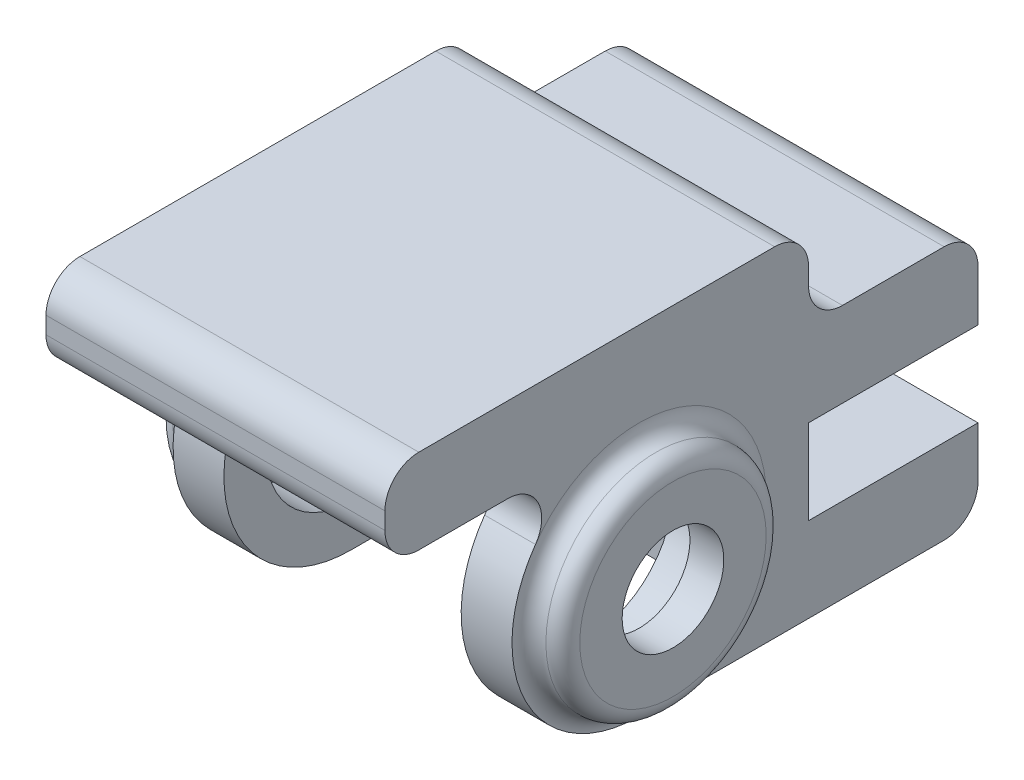
ISO-10303-21;
HEADER;
FILE_DESCRIPTION(('STEP AP214'),'2;1');
FILE_NAME('part.step','',(''),(''),'','','');
FILE_SCHEMA(('AUTOMOTIVE_DESIGN { 1 0 10303 214 1 1 1 1 }'));
ENDSEC;
DATA;
#1=APPLICATION_CONTEXT('core data for automotive mechanical design processes');
#2=APPLICATION_PROTOCOL_DEFINITION('international standard','automotive_design',2000,#1);
#3=PRODUCT_CONTEXT('',#1,'mechanical');
#4=PRODUCT('Part','Part','',(#3));
#5=PRODUCT_RELATED_PRODUCT_CATEGORY('part','',(#4));
#6=PRODUCT_DEFINITION_FORMATION('','',#4);
#7=PRODUCT_DEFINITION_CONTEXT('part definition',#1,'design');
#8=PRODUCT_DEFINITION('design','',#6,#7);
#9=PRODUCT_DEFINITION_SHAPE('','',#8);
#10=(LENGTH_UNIT() NAMED_UNIT(*) SI_UNIT(.MILLI.,.METRE.));
#11=(NAMED_UNIT(*) PLANE_ANGLE_UNIT() SI_UNIT($,.RADIAN.));
#12=(NAMED_UNIT(*) SI_UNIT($,.STERADIAN.) SOLID_ANGLE_UNIT());
#13=UNCERTAINTY_MEASURE_WITH_UNIT(LENGTH_MEASURE(1.E-05),#10,'distance_accuracy_value','');
#14=(GEOMETRIC_REPRESENTATION_CONTEXT(3) GLOBAL_UNCERTAINTY_ASSIGNED_CONTEXT((#13)) GLOBAL_UNIT_ASSIGNED_CONTEXT((#10,
#11,#12)) REPRESENTATION_CONTEXT('',''));
#15=CARTESIAN_POINT('',(0.,0.,0.));
#16=DIRECTION('',(0.,0.,1.));
#17=DIRECTION('',(1.,0.,0.));
#18=AXIS2_PLACEMENT_3D('',#15,#16,#17);
#19=CARTESIAN_POINT('',(10.,2.5,-20.));
#20=DIRECTION('',(0.,0.,1.));
#21=DIRECTION('',(1.,0.,0.));
#22=AXIS2_PLACEMENT_3D('',#19,#20,#21);
#23=PLANE('',#22);
#24=DIRECTION('',(0.,1.,0.));
#25=VECTOR('',#24,1.);
#26=CARTESIAN_POINT('',(-10.,2.5,-20.));
#27=LINE('',#26,#25);
#28=CARTESIAN_POINT('',(-10.,2.5,-20.));
#29=VERTEX_POINT('',#28);
#30=CARTESIAN_POINT('',(-10.,5.5,-20.));
#31=VERTEX_POINT('',#30);
#32=EDGE_CURVE('E251',#29,#31,#27,.T.);
#33=ORIENTED_EDGE('',*,*,#32,.T.);
#34=DIRECTION('',(-1.,0.,0.));
#35=VECTOR('',#34,1.);
#36=CARTESIAN_POINT('',(10.,5.5,-20.));
#37=LINE('',#36,#35);
#38=CARTESIAN_POINT('',(10.,5.5,-20.));
#39=VERTEX_POINT('',#38);
#40=EDGE_CURVE('E372',#31,#39,#37,.F.);
#41=ORIENTED_EDGE('',*,*,#40,.T.);
#42=DIRECTION('',(0.,1.,0.));
#43=VECTOR('',#42,1.);
#44=CARTESIAN_POINT('',(10.,2.5,-20.));
#45=LINE('',#44,#43);
#46=CARTESIAN_POINT('',(10.,2.5,-20.));
#47=VERTEX_POINT('',#46);
#48=EDGE_CURVE('E252',#47,#39,#45,.T.);
#49=ORIENTED_EDGE('',*,*,#48,.F.);
#50=DIRECTION('',(-1.,0.,0.));
#51=VECTOR('',#50,1.);
#52=CARTESIAN_POINT('',(10.,2.5,-20.));
#53=LINE('',#52,#51);
#54=EDGE_CURVE('E270',#47,#29,#53,.T.);
#55=ORIENTED_EDGE('',*,*,#54,.T.);
#56=EDGE_LOOP('',(#33,#41,#49,#55));
#57=FACE_BOUND('',#56,.T.);
#58=ADVANCED_FACE('F38',(#57),#23,.F.);
#59=CARTESIAN_POINT('',(10.,0.,0.));
#60=DIRECTION('',(-1.,0.,0.));
#61=DIRECTION('',(0.,0.,1.));
#62=AXIS2_PLACEMENT_3D('',#59,#60,#61);
#63=CYLINDRICAL_SURFACE('',#62,7.5);
#64=CARTESIAN_POINT('',(10.,0.,0.));
#65=DIRECTION('',(1.,0.,0.));
#66=DIRECTION('',(0.,0.,-1.));
#67=AXIS2_PLACEMENT_3D('',#64,#65,#66);
#68=CIRCLE('',#67,7.5);
#69=CARTESIAN_POINT('',(10.,4.3421052631579,6.11523686243276));
#70=VERTEX_POINT('',#69);
#71=CARTESIAN_POINT('',(10.,-7.5,0.));
#72=VERTEX_POINT('',#71);
#73=EDGE_CURVE('E255',#70,#72,#68,.T.);
#74=ORIENTED_EDGE('',*,*,#73,.F.);
#75=DIRECTION('',(-1.,0.,0.));
#76=VECTOR('',#75,1.);
#77=CARTESIAN_POINT('',(10.,4.3421052631579,6.11523686243276));
#78=LINE('',#77,#76);
#79=CARTESIAN_POINT('',(7.,4.3421052631579,6.11523686243276));
#80=VERTEX_POINT('',#79);
#81=EDGE_CURVE('E333',#70,#80,#78,.T.);
#82=ORIENTED_EDGE('',*,*,#81,.T.);
#83=CARTESIAN_POINT('',(7.,0.,0.));
#84=DIRECTION('',(1.,0.,0.));
#85=DIRECTION('',(0.,0.,-1.));
#86=AXIS2_PLACEMENT_3D('',#83,#84,#85);
#87=CIRCLE('',#86,7.5);
#88=CARTESIAN_POINT('',(7.,-7.5,0.));
#89=VERTEX_POINT('',#88);
#90=EDGE_CURVE('E246',#80,#89,#87,.T.);
#91=ORIENTED_EDGE('',*,*,#90,.T.);
#92=DIRECTION('',(-1.,0.,0.));
#93=VECTOR('',#92,1.);
#94=CARTESIAN_POINT('',(10.,-7.5,0.));
#95=LINE('',#94,#93);
#96=EDGE_CURVE('E232',#72,#89,#95,.T.);
#97=ORIENTED_EDGE('',*,*,#96,.F.);
#98=EDGE_LOOP('',(#74,#82,#91,#97));
#99=FACE_BOUND('',#98,.T.);
#100=ADVANCED_FACE('F401',(#99),#63,.T.);
#101=CARTESIAN_POINT('',(10.,0.,0.));
#102=DIRECTION('',(-1.,0.,0.));
#103=DIRECTION('',(0.,0.,1.));
#104=AXIS2_PLACEMENT_3D('',#101,#102,#103);
#105=CYLINDRICAL_SURFACE('',#104,5.);
#106=CARTESIAN_POINT('',(7.,0.,0.));
#107=DIRECTION('',(1.,0.,0.));
#108=DIRECTION('',(0.,0.,-1.));
#109=AXIS2_PLACEMENT_3D('',#106,#107,#108);
#110=CIRCLE('',#109,5.);
#111=CARTESIAN_POINT('',(7.,0.,-5.));
#112=VERTEX_POINT('',#111);
#113=EDGE_CURVE('E245',#112,#112,#110,.T.);
#114=ORIENTED_EDGE('',*,*,#113,.F.);
#115=EDGE_LOOP('',(#114));
#116=FACE_BOUND('',#115,.T.);
#117=CARTESIAN_POINT('',(10.,0.,0.));
#118=DIRECTION('',(1.,0.,0.));
#119=DIRECTION('',(0.,0.,-1.));
#120=AXIS2_PLACEMENT_3D('',#117,#118,#119);
#121=CIRCLE('',#120,5.);
#122=CARTESIAN_POINT('',(10.,0.,-5.));
#123=VERTEX_POINT('',#122);
#124=EDGE_CURVE('E392',#123,#123,#121,.T.);
#125=ORIENTED_EDGE('',*,*,#124,.T.);
#126=EDGE_LOOP('',(#125));
#127=FACE_BOUND('',#126,.T.);
#128=ADVANCED_FACE('F560',(#116,#127),#105,.F.);
#129=CARTESIAN_POINT('',(10.,0.,0.));
#130=DIRECTION('',(1.,0.,0.));
#131=DIRECTION('',(0.,0.,-1.));
#132=AXIS2_PLACEMENT_3D('',#129,#130,#131);
#133=PLANE('',#132);
#134=CARTESIAN_POINT('',(10.,5.5,7.74596669241483));
#135=DIRECTION('',(1.,0.,0.));
#136=DIRECTION('',(0.,0.,-1.));
#137=AXIS2_PLACEMENT_3D('',#134,#135,#136);
#138=CIRCLE('',#137,2.);
#139=CARTESIAN_POINT('',(10.,7.5,7.74596669241483));
#140=VERTEX_POINT('',#139);
#141=EDGE_CURVE('E348',#140,#70,#138,.F.);
#142=ORIENTED_EDGE('',*,*,#141,.T.);
#143=CARTESIAN_POINT('',(10.,0.,0.));
#144=DIRECTION('',(1.,0.,0.));
#145=DIRECTION('',(0.,0.,-1.));
#146=AXIS2_PLACEMENT_3D('',#143,#144,#145);
#147=CIRCLE('',#146,7.5);
#148=EDGE_CURVE('E47',#70,#72,#147,.F.);
#149=ORIENTED_EDGE('',*,*,#148,.T.);
#150=DIRECTION('',(0.,0.,-1.));
#151=VECTOR('',#150,1.);
#152=CARTESIAN_POINT('',(10.,-7.5,0.));
#153=LINE('',#152,#151);
#154=CARTESIAN_POINT('',(10.,-7.5,-18.));
#155=VERTEX_POINT('',#154);
#156=EDGE_CURVE('E259',#72,#155,#153,.T.);
#157=ORIENTED_EDGE('',*,*,#156,.T.);
#158=CARTESIAN_POINT('',(10.,-5.5,-18.));
#159=DIRECTION('',(1.,0.,0.));
#160=DIRECTION('',(0.,0.,-1.));
#161=AXIS2_PLACEMENT_3D('',#158,#159,#160);
#162=CIRCLE('',#161,2.);
#163=CARTESIAN_POINT('',(10.,-5.5,-20.));
#164=VERTEX_POINT('',#163);
#165=EDGE_CURVE('E307',#155,#164,#162,.T.);
#166=ORIENTED_EDGE('',*,*,#165,.T.);
#167=DIRECTION('',(0.,1.,0.));
#168=VECTOR('',#167,1.);
#169=CARTESIAN_POINT('',(10.,-7.5,-20.));
#170=LINE('',#169,#168);
#171=CARTESIAN_POINT('',(10.,-2.5,-20.));
#172=VERTEX_POINT('',#171);
#173=EDGE_CURVE('E262',#164,#172,#170,.T.);
#174=ORIENTED_EDGE('',*,*,#173,.T.);
#175=DIRECTION('',(0.,0.,1.));
#176=VECTOR('',#175,1.);
#177=CARTESIAN_POINT('',(10.,-2.5,-20.));
#178=LINE('',#177,#176);
#179=CARTESIAN_POINT('',(10.,-2.5,-10.));
#180=VERTEX_POINT('',#179);
#181=EDGE_CURVE('E264',#172,#180,#178,.T.);
#182=ORIENTED_EDGE('',*,*,#181,.T.);
#183=DIRECTION('',(0.,1.,0.));
#184=VECTOR('',#183,1.);
#185=CARTESIAN_POINT('',(10.,-2.5,-10.));
#186=LINE('',#185,#184);
#187=CARTESIAN_POINT('',(10.,2.5,-10.));
#188=VERTEX_POINT('',#187);
#189=EDGE_CURVE('E266',#180,#188,#186,.T.);
#190=ORIENTED_EDGE('',*,*,#189,.T.);
#191=DIRECTION('',(0.,0.,-1.));
#192=VECTOR('',#191,1.);
#193=CARTESIAN_POINT('',(10.,2.5,-10.));
#194=LINE('',#193,#192);
#195=EDGE_CURVE('E268',#188,#47,#194,.T.);
#196=ORIENTED_EDGE('',*,*,#195,.T.);
#197=ORIENTED_EDGE('',*,*,#48,.T.);
#198=CARTESIAN_POINT('',(10.,5.5,-18.));
#199=DIRECTION('',(1.,0.,0.));
#200=DIRECTION('',(0.,0.,-1.));
#201=AXIS2_PLACEMENT_3D('',#198,#199,#200);
#202=CIRCLE('',#201,2.);
#203=CARTESIAN_POINT('',(10.,7.5,-18.));
#204=VERTEX_POINT('',#203);
#205=EDGE_CURVE('E362',#39,#204,#202,.T.);
#206=ORIENTED_EDGE('',*,*,#205,.T.);
#207=DIRECTION('',(0.,0.,-1.));
#208=VECTOR('',#207,1.);
#209=CARTESIAN_POINT('',(10.,7.5,-10.));
#210=LINE('',#209,#208);
#211=CARTESIAN_POINT('',(10.,7.5,-12.));
#212=VERTEX_POINT('',#211);
#213=EDGE_CURVE('E424',#212,#204,#210,.T.);
#214=ORIENTED_EDGE('',*,*,#213,.F.);
#215=CARTESIAN_POINT('',(10.,9.5,-12.));
#216=DIRECTION('',(1.,0.,0.));
#217=DIRECTION('',(0.,0.,-1.));
#218=AXIS2_PLACEMENT_3D('',#215,#216,#217);
#219=CIRCLE('',#218,2.);
#220=CARTESIAN_POINT('',(10.,9.5,-10.));
#221=VERTEX_POINT('',#220);
#222=EDGE_CURVE('E374',#212,#221,#219,.F.);
#223=ORIENTED_EDGE('',*,*,#222,.T.);
#224=DIRECTION('',(0.,1.,0.));
#225=VECTOR('',#224,1.);
#226=CARTESIAN_POINT('',(10.,7.5,-10.));
#227=LINE('',#226,#225);
#228=CARTESIAN_POINT('',(10.,10.5,-10.));
#229=VERTEX_POINT('',#228);
#230=EDGE_CURVE('E433',#221,#229,#227,.T.);
#231=ORIENTED_EDGE('',*,*,#230,.T.);
#232=CARTESIAN_POINT('',(10.,10.5,-8.));
#233=DIRECTION('',(1.,0.,0.));
#234=DIRECTION('',(0.,0.,-1.));
#235=AXIS2_PLACEMENT_3D('',#232,#233,#234);
#236=CIRCLE('',#235,2.);
#237=CARTESIAN_POINT('',(10.,12.5,-8.));
#238=VERTEX_POINT('',#237);
#239=EDGE_CURVE('E364',#229,#238,#236,.T.);
#240=ORIENTED_EDGE('',*,*,#239,.T.);
#241=DIRECTION('',(0.,0.,-1.));
#242=VECTOR('',#241,1.);
#243=CARTESIAN_POINT('',(10.,12.5,-20.));
#244=LINE('',#243,#242);
#245=CARTESIAN_POINT('',(10.,12.5,13.));
#246=VERTEX_POINT('',#245);
#247=EDGE_CURVE('E441',#246,#238,#244,.T.);
#248=ORIENTED_EDGE('',*,*,#247,.F.);
#249=CARTESIAN_POINT('',(10.,10.5,13.));
#250=DIRECTION('',(1.,0.,0.));
#251=DIRECTION('',(0.,0.,-1.));
#252=AXIS2_PLACEMENT_3D('',#249,#250,#251);
#253=CIRCLE('',#252,2.);
#254=CARTESIAN_POINT('',(10.,10.5,15.));
#255=VERTEX_POINT('',#254);
#256=EDGE_CURVE('E309',#246,#255,#253,.T.);
#257=ORIENTED_EDGE('',*,*,#256,.T.);
#258=DIRECTION('',(0.,-1.,0.));
#259=VECTOR('',#258,1.);
#260=CARTESIAN_POINT('',(10.,12.5,15.));
#261=LINE('',#260,#259);
#262=CARTESIAN_POINT('',(10.,9.5,15.));
#263=VERTEX_POINT('',#262);
#264=EDGE_CURVE('E445',#255,#263,#261,.T.);
#265=ORIENTED_EDGE('',*,*,#264,.T.);
#266=CARTESIAN_POINT('',(10.,9.5,13.));
#267=DIRECTION('',(1.,0.,0.));
#268=DIRECTION('',(0.,0.,-1.));
#269=AXIS2_PLACEMENT_3D('',#266,#267,#268);
#270=CIRCLE('',#269,2.);
#271=CARTESIAN_POINT('',(10.,7.5,13.));
#272=VERTEX_POINT('',#271);
#273=EDGE_CURVE('E311',#263,#272,#270,.T.);
#274=ORIENTED_EDGE('',*,*,#273,.T.);
#275=DIRECTION('',(0.,0.,-1.));
#276=VECTOR('',#275,1.);
#277=CARTESIAN_POINT('',(10.,7.5,-20.));
#278=LINE('',#277,#276);
#279=EDGE_CURVE('E442',#272,#140,#278,.T.);
#280=ORIENTED_EDGE('',*,*,#279,.T.);
#281=EDGE_LOOP('',(#142,#149,#157,#166,#174,#182,#190,#196,#197,#206,#214,#223,#231,#240,#248,
#257,#265,#274,#280));
#282=FACE_BOUND('',#281,.T.);
#283=ADVANCED_FACE('F394',(#282),#133,.T.);
#284=CARTESIAN_POINT('',(-10.,0.,0.));
#285=DIRECTION('',(1.,0.,0.));
#286=DIRECTION('',(0.,0.,-1.));
#287=AXIS2_PLACEMENT_3D('',#284,#285,#286);
#288=PLANE('',#287);
#289=DIRECTION('',(0.,0.,-1.));
#290=VECTOR('',#289,1.);
#291=CARTESIAN_POINT('',(-10.,-7.5,0.));
#292=LINE('',#291,#290);
#293=CARTESIAN_POINT('',(-10.,-7.5,0.));
#294=VERTEX_POINT('',#293);
#295=CARTESIAN_POINT('',(-10.,-7.5,-18.));
#296=VERTEX_POINT('',#295);
#297=EDGE_CURVE('E276',#294,#296,#292,.T.);
#298=ORIENTED_EDGE('',*,*,#297,.F.);
#299=CARTESIAN_POINT('',(-10.,0.,0.));
#300=DIRECTION('',(1.,0.,0.));
#301=DIRECTION('',(0.,0.,-1.));
#302=AXIS2_PLACEMENT_3D('',#299,#300,#301);
#303=CIRCLE('',#302,7.5);
#304=CARTESIAN_POINT('',(-10.,4.3421052631579,6.11523686243276));
#305=VERTEX_POINT('',#304);
#306=EDGE_CURVE('E386',#294,#305,#303,.T.);
#307=ORIENTED_EDGE('',*,*,#306,.T.);
#308=CARTESIAN_POINT('',(-10.,5.5,7.74596669241483));
#309=DIRECTION('',(1.,0.,0.));
#310=DIRECTION('',(0.,0.,-1.));
#311=AXIS2_PLACEMENT_3D('',#308,#309,#310);
#312=CIRCLE('',#311,2.);
#313=CARTESIAN_POINT('',(-10.,7.5,7.74596669241483));
#314=VERTEX_POINT('',#313);
#315=EDGE_CURVE('E341',#305,#314,#312,.T.);
#316=ORIENTED_EDGE('',*,*,#315,.T.);
#317=DIRECTION('',(0.,0.,1.));
#318=VECTOR('',#317,1.);
#319=CARTESIAN_POINT('',(-10.,7.5,15.));
#320=LINE('',#319,#318);
#321=CARTESIAN_POINT('',(-10.,7.5,13.));
#322=VERTEX_POINT('',#321);
#323=EDGE_CURVE('E436',#314,#322,#320,.T.);
#324=ORIENTED_EDGE('',*,*,#323,.T.);
#325=CARTESIAN_POINT('',(-10.,9.5,13.));
#326=DIRECTION('',(1.,0.,0.));
#327=DIRECTION('',(0.,0.,-1.));
#328=AXIS2_PLACEMENT_3D('',#325,#326,#327);
#329=CIRCLE('',#328,2.);
#330=CARTESIAN_POINT('',(-10.,9.5,15.));
#331=VERTEX_POINT('',#330);
#332=EDGE_CURVE('E325',#322,#331,#329,.F.);
#333=ORIENTED_EDGE('',*,*,#332,.T.);
#334=DIRECTION('',(0.,-1.,0.));
#335=VECTOR('',#334,1.);
#336=CARTESIAN_POINT('',(-10.,12.5,15.));
#337=LINE('',#336,#335);
#338=CARTESIAN_POINT('',(-10.,10.5,15.));
#339=VERTEX_POINT('',#338);
#340=EDGE_CURVE('E451',#339,#331,#337,.T.);
#341=ORIENTED_EDGE('',*,*,#340,.F.);
#342=CARTESIAN_POINT('',(-10.,10.5,13.));
#343=DIRECTION('',(1.,0.,0.));
#344=DIRECTION('',(0.,0.,-1.));
#345=AXIS2_PLACEMENT_3D('',#342,#343,#344);
#346=CIRCLE('',#345,2.);
#347=CARTESIAN_POINT('',(-10.,12.5,13.));
#348=VERTEX_POINT('',#347);
#349=EDGE_CURVE('E322',#339,#348,#346,.F.);
#350=ORIENTED_EDGE('',*,*,#349,.T.);
#351=DIRECTION('',(0.,0.,1.));
#352=VECTOR('',#351,1.);
#353=CARTESIAN_POINT('',(-10.,12.5,15.));
#354=LINE('',#353,#352);
#355=CARTESIAN_POINT('',(-10.,12.5,-8.));
#356=VERTEX_POINT('',#355);
#357=EDGE_CURVE('E439',#356,#348,#354,.T.);
#358=ORIENTED_EDGE('',*,*,#357,.F.);
#359=CARTESIAN_POINT('',(-10.,10.5,-8.));
#360=DIRECTION('',(1.,0.,0.));
#361=DIRECTION('',(0.,0.,-1.));
#362=AXIS2_PLACEMENT_3D('',#359,#360,#361);
#363=CIRCLE('',#362,2.);
#364=CARTESIAN_POINT('',(-10.,10.5,-10.));
#365=VERTEX_POINT('',#364);
#366=EDGE_CURVE('E370',#356,#365,#363,.F.);
#367=ORIENTED_EDGE('',*,*,#366,.T.);
#368=DIRECTION('',(0.,1.,0.));
#369=VECTOR('',#368,1.);
#370=CARTESIAN_POINT('',(-10.,7.5,-10.));
#371=LINE('',#370,#369);
#372=CARTESIAN_POINT('',(-10.,9.5,-10.));
#373=VERTEX_POINT('',#372);
#374=EDGE_CURVE('E432',#373,#365,#371,.T.);
#375=ORIENTED_EDGE('',*,*,#374,.F.);
#376=CARTESIAN_POINT('',(-10.,9.5,-12.));
#377=DIRECTION('',(1.,0.,0.));
#378=DIRECTION('',(0.,0.,-1.));
#379=AXIS2_PLACEMENT_3D('',#376,#377,#378);
#380=CIRCLE('',#379,2.);
#381=CARTESIAN_POINT('',(-10.,7.5,-12.));
#382=VERTEX_POINT('',#381);
#383=EDGE_CURVE('E376',#373,#382,#380,.T.);
#384=ORIENTED_EDGE('',*,*,#383,.T.);
#385=DIRECTION('',(0.,0.,1.));
#386=VECTOR('',#385,1.);
#387=CARTESIAN_POINT('',(-10.,7.5,-20.));
#388=LINE('',#387,#386);
#389=CARTESIAN_POINT('',(-10.,7.5,-18.));
#390=VERTEX_POINT('',#389);
#391=EDGE_CURVE('E429',#390,#382,#388,.T.);
#392=ORIENTED_EDGE('',*,*,#391,.F.);
#393=CARTESIAN_POINT('',(-10.,5.5,-18.));
#394=DIRECTION('',(1.,0.,0.));
#395=DIRECTION('',(0.,0.,-1.));
#396=AXIS2_PLACEMENT_3D('',#393,#394,#395);
#397=CIRCLE('',#396,2.);
#398=EDGE_CURVE('E368',#390,#31,#397,.F.);
#399=ORIENTED_EDGE('',*,*,#398,.T.);
#400=ORIENTED_EDGE('',*,*,#32,.F.);
#401=DIRECTION('',(0.,0.,-1.));
#402=VECTOR('',#401,1.);
#403=CARTESIAN_POINT('',(-10.,2.5,-10.));
#404=LINE('',#403,#402);
#405=CARTESIAN_POINT('',(-10.,2.5,-10.));
#406=VERTEX_POINT('',#405);
#407=EDGE_CURVE('E256',#406,#29,#404,.T.);
#408=ORIENTED_EDGE('',*,*,#407,.F.);
#409=DIRECTION('',(0.,1.,0.));
#410=VECTOR('',#409,1.);
#411=CARTESIAN_POINT('',(-10.,-2.5,-10.));
#412=LINE('',#411,#410);
#413=CARTESIAN_POINT('',(-10.,-2.5,-10.));
#414=VERTEX_POINT('',#413);
#415=EDGE_CURVE('E282',#414,#406,#412,.T.);
#416=ORIENTED_EDGE('',*,*,#415,.F.);
#417=DIRECTION('',(0.,0.,1.));
#418=VECTOR('',#417,1.);
#419=CARTESIAN_POINT('',(-10.,-2.5,-20.));
#420=LINE('',#419,#418);
#421=CARTESIAN_POINT('',(-10.,-2.5,-20.));
#422=VERTEX_POINT('',#421);
#423=EDGE_CURVE('E280',#422,#414,#420,.T.);
#424=ORIENTED_EDGE('',*,*,#423,.F.);
#425=DIRECTION('',(0.,1.,0.));
#426=VECTOR('',#425,1.);
#427=CARTESIAN_POINT('',(-10.,-7.5,-20.));
#428=LINE('',#427,#426);
#429=CARTESIAN_POINT('',(-10.,-5.5,-20.));
#430=VERTEX_POINT('',#429);
#431=EDGE_CURVE('E278',#430,#422,#428,.T.);
#432=ORIENTED_EDGE('',*,*,#431,.F.);
#433=CARTESIAN_POINT('',(-10.,-5.5,-18.));
#434=DIRECTION('',(1.,0.,0.));
#435=DIRECTION('',(0.,0.,-1.));
#436=AXIS2_PLACEMENT_3D('',#433,#434,#435);
#437=CIRCLE('',#436,2.);
#438=EDGE_CURVE('E320',#430,#296,#437,.F.);
#439=ORIENTED_EDGE('',*,*,#438,.T.);
#440=EDGE_LOOP('',(#298,#307,#316,#324,#333,#341,#350,#358,#367,#375,#384,#392,#399,#400,#408,
#416,#424,#432,#439));
#441=FACE_BOUND('',#440,.T.);
#442=ADVANCED_FACE('F469',(#441),#288,.F.);
#443=CARTESIAN_POINT('',(-7.,0.,0.));
#444=DIRECTION('',(-1.,0.,0.));
#445=DIRECTION('',(0.,0.,1.));
#446=AXIS2_PLACEMENT_3D('',#443,#444,#445);
#447=CIRCLE('',#446,7.5);
#448=CARTESIAN_POINT('',(-7.,-7.5,0.));
#449=VERTEX_POINT('',#448);
#450=CARTESIAN_POINT('',(-7.,4.3421052631579,6.11523686243276));
#451=VERTEX_POINT('',#450);
#452=EDGE_CURVE('E242',#449,#451,#447,.T.);
#453=ORIENTED_EDGE('',*,*,#452,.T.);
#454=DIRECTION('',(-1.,0.,0.));
#455=VECTOR('',#454,1.);
#456=CARTESIAN_POINT('',(10.,4.3421052631579,6.11523686243276));
#457=LINE('',#456,#455);
#458=EDGE_CURVE('E330',#451,#305,#457,.T.);
#459=ORIENTED_EDGE('',*,*,#458,.T.);
#460=CARTESIAN_POINT('',(-10.,0.,0.));
#461=DIRECTION('',(1.,0.,0.));
#462=DIRECTION('',(0.,0.,-1.));
#463=AXIS2_PLACEMENT_3D('',#460,#461,#462);
#464=CIRCLE('',#463,7.5);
#465=EDGE_CURVE('E273',#305,#294,#464,.T.);
#466=ORIENTED_EDGE('',*,*,#465,.T.);
#467=EDGE_CURVE('E296',#449,#294,#95,.T.);
#468=ORIENTED_EDGE('',*,*,#467,.F.);
#469=EDGE_LOOP('',(#453,#459,#466,#468));
#470=FACE_BOUND('',#469,.T.);
#471=ADVANCED_FACE('F461',(#470),#63,.T.);
#472=CARTESIAN_POINT('',(10.,-7.5,0.));
#473=DIRECTION('',(0.,1.,0.));
#474=DIRECTION('',(0.,0.,1.));
#475=AXIS2_PLACEMENT_3D('',#472,#473,#474);
#476=PLANE('',#475);
#477=ORIENTED_EDGE('',*,*,#297,.T.);
#478=DIRECTION('',(-1.,0.,0.));
#479=VECTOR('',#478,1.);
#480=CARTESIAN_POINT('',(10.,-7.5,-18.));
#481=LINE('',#480,#479);
#482=EDGE_CURVE('E339',#296,#155,#481,.F.);
#483=ORIENTED_EDGE('',*,*,#482,.T.);
#484=ORIENTED_EDGE('',*,*,#156,.F.);
#485=ORIENTED_EDGE('',*,*,#96,.T.);
#486=DIRECTION('',(0.,0.,-1.));
#487=VECTOR('',#486,1.);
#488=CARTESIAN_POINT('',(7.,-7.5,-8.5));
#489=LINE('',#488,#487);
#490=CARTESIAN_POINT('',(7.,-7.5,-8.5));
#491=VERTEX_POINT('',#490);
#492=EDGE_CURVE('E211',#89,#491,#489,.T.);
#493=ORIENTED_EDGE('',*,*,#492,.T.);
#494=DIRECTION('',(-1.,0.,0.));
#495=VECTOR('',#494,1.);
#496=CARTESIAN_POINT('',(-7.,-7.5,-8.5));
#497=LINE('',#496,#495);
#498=CARTESIAN_POINT('',(-7.,-7.5,-8.5));
#499=VERTEX_POINT('',#498);
#500=EDGE_CURVE('E223',#491,#499,#497,.T.);
#501=ORIENTED_EDGE('',*,*,#500,.T.);
#502=DIRECTION('',(0.,0.,1.));
#503=VECTOR('',#502,1.);
#504=CARTESIAN_POINT('',(-7.,-7.5,-8.5));
#505=LINE('',#504,#503);
#506=EDGE_CURVE('E219',#499,#449,#505,.T.);
#507=ORIENTED_EDGE('',*,*,#506,.T.);
#508=ORIENTED_EDGE('',*,*,#467,.T.);
#509=EDGE_LOOP('',(#477,#483,#484,#485,#493,#501,#507,#508));
#510=FACE_BOUND('',#509,.T.);
#511=ADVANCED_FACE('F229',(#510),#476,.F.);
#512=CARTESIAN_POINT('',(10.,-7.5,-20.));
#513=DIRECTION('',(0.,0.,1.));
#514=DIRECTION('',(1.,0.,0.));
#515=AXIS2_PLACEMENT_3D('',#512,#513,#514);
#516=PLANE('',#515);
#517=ORIENTED_EDGE('',*,*,#173,.F.);
#518=DIRECTION('',(-1.,0.,0.));
#519=VECTOR('',#518,1.);
#520=CARTESIAN_POINT('',(10.,-5.5,-20.));
#521=LINE('',#520,#519);
#522=EDGE_CURVE('E336',#164,#430,#521,.T.);
#523=ORIENTED_EDGE('',*,*,#522,.T.);
#524=ORIENTED_EDGE('',*,*,#431,.T.);
#525=DIRECTION('',(-1.,0.,0.));
#526=VECTOR('',#525,1.);
#527=CARTESIAN_POINT('',(10.,-2.5,-20.));
#528=LINE('',#527,#526);
#529=EDGE_CURVE('E293',#172,#422,#528,.T.);
#530=ORIENTED_EDGE('',*,*,#529,.F.);
#531=EDGE_LOOP('',(#517,#523,#524,#530));
#532=FACE_BOUND('',#531,.T.);
#533=ADVANCED_FACE('F540',(#532),#516,.F.);
#534=CARTESIAN_POINT('',(10.,-2.5,-20.));
#535=DIRECTION('',(0.,-1.,0.));
#536=DIRECTION('',(0.,0.,-1.));
#537=AXIS2_PLACEMENT_3D('',#534,#535,#536);
#538=PLANE('',#537);
#539=ORIENTED_EDGE('',*,*,#423,.T.);
#540=DIRECTION('',(-1.,0.,0.));
#541=VECTOR('',#540,1.);
#542=CARTESIAN_POINT('',(10.,-2.5,-10.));
#543=LINE('',#542,#541);
#544=EDGE_CURVE('E290',#180,#414,#543,.T.);
#545=ORIENTED_EDGE('',*,*,#544,.F.);
#546=ORIENTED_EDGE('',*,*,#181,.F.);
#547=ORIENTED_EDGE('',*,*,#529,.T.);
#548=EDGE_LOOP('',(#539,#545,#546,#547));
#549=FACE_BOUND('',#548,.T.);
#550=ADVANCED_FACE('F536',(#549),#538,.F.);
#551=CARTESIAN_POINT('',(10.,-2.5,-10.));
#552=DIRECTION('',(0.,0.,1.));
#553=DIRECTION('',(1.,0.,0.));
#554=AXIS2_PLACEMENT_3D('',#551,#552,#553);
#555=PLANE('',#554);
#556=ORIENTED_EDGE('',*,*,#415,.T.);
#557=DIRECTION('',(-1.,0.,0.));
#558=VECTOR('',#557,1.);
#559=CARTESIAN_POINT('',(10.,2.5,-10.));
#560=LINE('',#559,#558);
#561=EDGE_CURVE('E287',#188,#406,#560,.T.);
#562=ORIENTED_EDGE('',*,*,#561,.F.);
#563=ORIENTED_EDGE('',*,*,#189,.F.);
#564=ORIENTED_EDGE('',*,*,#544,.T.);
#565=EDGE_LOOP('',(#556,#562,#563,#564));
#566=FACE_BOUND('',#565,.T.);
#567=ADVANCED_FACE('F532',(#566),#555,.F.);
#568=CARTESIAN_POINT('',(10.,2.5,-10.));
#569=DIRECTION('',(0.,1.,0.));
#570=DIRECTION('',(0.,0.,1.));
#571=AXIS2_PLACEMENT_3D('',#568,#569,#570);
#572=PLANE('',#571);
#573=ORIENTED_EDGE('',*,*,#407,.T.);
#574=ORIENTED_EDGE('',*,*,#54,.F.);
#575=ORIENTED_EDGE('',*,*,#195,.F.);
#576=ORIENTED_EDGE('',*,*,#561,.T.);
#577=EDGE_LOOP('',(#573,#574,#575,#576));
#578=FACE_BOUND('',#577,.T.);
#579=ADVANCED_FACE('F527',(#578),#572,.F.);
#580=CARTESIAN_POINT('',(-7.,0.,0.));
#581=DIRECTION('',(-1.,0.,0.));
#582=DIRECTION('',(0.,0.,1.));
#583=AXIS2_PLACEMENT_3D('',#580,#581,#582);
#584=CIRCLE('',#583,5.);
#585=CARTESIAN_POINT('',(-7.,0.,5.));
#586=VERTEX_POINT('',#585);
#587=EDGE_CURVE('E240',#586,#586,#584,.T.);
#588=ORIENTED_EDGE('',*,*,#587,.F.);
#589=EDGE_LOOP('',(#588));
#590=FACE_BOUND('',#589,.T.);
#591=CARTESIAN_POINT('',(-10.,0.,0.));
#592=DIRECTION('',(1.,0.,0.));
#593=DIRECTION('',(0.,0.,-1.));
#594=AXIS2_PLACEMENT_3D('',#591,#592,#593);
#595=CIRCLE('',#594,5.);
#596=CARTESIAN_POINT('',(-10.,0.,-5.));
#597=VERTEX_POINT('',#596);
#598=EDGE_CURVE('E248',#597,#597,#595,.T.);
#599=ORIENTED_EDGE('',*,*,#598,.F.);
#600=EDGE_LOOP('',(#599));
#601=FACE_BOUND('',#600,.T.);
#602=ADVANCED_FACE('F685',(#590,#601),#105,.F.);
#603=CARTESIAN_POINT('',(7.,-7.5,-8.5));
#604=DIRECTION('',(1.,0.,0.));
#605=DIRECTION('',(0.,0.,-1.));
#606=AXIS2_PLACEMENT_3D('',#603,#604,#605);
#607=PLANE('',#606);
#608=ORIENTED_EDGE('',*,*,#113,.T.);
#609=EDGE_LOOP('',(#608));
#610=FACE_BOUND('',#609,.T.);
#611=DIRECTION('',(0.,0.,-1.));
#612=VECTOR('',#611,1.);
#613=CARTESIAN_POINT('',(7.,7.5,-8.5));
#614=LINE('',#613,#612);
#615=CARTESIAN_POINT('',(7.,7.5,7.74596669241483));
#616=VERTEX_POINT('',#615);
#617=CARTESIAN_POINT('',(7.,7.5,-3.5));
#618=VERTEX_POINT('',#617);
#619=EDGE_CURVE('E235',#616,#618,#614,.T.);
#620=ORIENTED_EDGE('',*,*,#619,.T.);
#621=CARTESIAN_POINT('',(7.,2.5,-3.5));
#622=DIRECTION('',(1.,0.,0.));
#623=DIRECTION('',(0.,0.,-1.));
#624=AXIS2_PLACEMENT_3D('',#621,#622,#623);
#625=CIRCLE('',#624,5.);
#626=CARTESIAN_POINT('',(7.,2.5,-8.5));
#627=VERTEX_POINT('',#626);
#628=EDGE_CURVE('E214',#618,#627,#625,.F.);
#629=ORIENTED_EDGE('',*,*,#628,.T.);
#630=DIRECTION('',(0.,1.,0.));
#631=VECTOR('',#630,1.);
#632=CARTESIAN_POINT('',(7.,-7.5,-8.5));
#633=LINE('',#632,#631);
#634=EDGE_CURVE('E206',#491,#627,#633,.T.);
#635=ORIENTED_EDGE('',*,*,#634,.F.);
#636=ORIENTED_EDGE('',*,*,#492,.F.);
#637=ORIENTED_EDGE('',*,*,#90,.F.);
#638=CARTESIAN_POINT('',(7.,5.5,7.74596669241483));
#639=DIRECTION('',(1.,0.,0.));
#640=DIRECTION('',(0.,0.,-1.));
#641=AXIS2_PLACEMENT_3D('',#638,#639,#640);
#642=CIRCLE('',#641,2.);
#643=EDGE_CURVE('E345',#80,#616,#642,.T.);
#644=ORIENTED_EDGE('',*,*,#643,.T.);
#645=EDGE_LOOP('',(#620,#629,#635,#636,#637,#644));
#646=FACE_BOUND('',#645,.T.);
#647=ADVANCED_FACE('F208',(#610,#646),#607,.F.);
#648=CARTESIAN_POINT('',(-7.,-7.5,-8.5));
#649=DIRECTION('',(-1.,0.,0.));
#650=DIRECTION('',(0.,0.,1.));
#651=AXIS2_PLACEMENT_3D('',#648,#649,#650);
#652=PLANE('',#651);
#653=ORIENTED_EDGE('',*,*,#587,.T.);
#654=EDGE_LOOP('',(#653));
#655=FACE_BOUND('',#654,.T.);
#656=DIRECTION('',(0.,1.,0.));
#657=VECTOR('',#656,1.);
#658=CARTESIAN_POINT('',(-7.,-7.5,-8.5));
#659=LINE('',#658,#657);
#660=CARTESIAN_POINT('',(-7.,2.5,-8.5));
#661=VERTEX_POINT('',#660);
#662=EDGE_CURVE('E218',#499,#661,#659,.T.);
#663=ORIENTED_EDGE('',*,*,#662,.T.);
#664=CARTESIAN_POINT('',(-7.,2.5,-3.5));
#665=DIRECTION('',(-1.,0.,0.));
#666=DIRECTION('',(0.,0.,1.));
#667=AXIS2_PLACEMENT_3D('',#664,#665,#666);
#668=CIRCLE('',#667,5.);
#669=CARTESIAN_POINT('',(-7.,7.5,-3.5));
#670=VERTEX_POINT('',#669);
#671=EDGE_CURVE('E62',#661,#670,#668,.F.);
#672=ORIENTED_EDGE('',*,*,#671,.T.);
#673=DIRECTION('',(0.,0.,1.));
#674=VECTOR('',#673,1.);
#675=CARTESIAN_POINT('',(-7.,7.5,-8.5));
#676=LINE('',#675,#674);
#677=CARTESIAN_POINT('',(-7.,7.5,7.74596669241483));
#678=VERTEX_POINT('',#677);
#679=EDGE_CURVE('E233',#670,#678,#676,.T.);
#680=ORIENTED_EDGE('',*,*,#679,.T.);
#681=CARTESIAN_POINT('',(-7.,5.5,7.74596669241483));
#682=DIRECTION('',(-1.,0.,0.));
#683=DIRECTION('',(0.,0.,1.));
#684=AXIS2_PLACEMENT_3D('',#681,#682,#683);
#685=CIRCLE('',#684,2.);
#686=EDGE_CURVE('E343',#678,#451,#685,.T.);
#687=ORIENTED_EDGE('',*,*,#686,.T.);
#688=ORIENTED_EDGE('',*,*,#452,.F.);
#689=ORIENTED_EDGE('',*,*,#506,.F.);
#690=EDGE_LOOP('',(#663,#672,#680,#687,#688,#689));
#691=FACE_BOUND('',#690,.T.);
#692=ADVANCED_FACE('F456',(#655,#691),#652,.F.);
#693=CARTESIAN_POINT('',(-7.,-7.5,-8.5));
#694=DIRECTION('',(0.,0.,-1.));
#695=DIRECTION('',(-1.,0.,0.));
#696=AXIS2_PLACEMENT_3D('',#693,#694,#695);
#697=PLANE('',#696);
#698=ORIENTED_EDGE('',*,*,#634,.T.);
#699=DIRECTION('',(-1.,0.,0.));
#700=VECTOR('',#699,1.);
#701=CARTESIAN_POINT('',(-7.,2.5,-8.5));
#702=LINE('',#701,#700);
#703=EDGE_CURVE('E378',#627,#661,#702,.T.);
#704=ORIENTED_EDGE('',*,*,#703,.T.);
#705=ORIENTED_EDGE('',*,*,#662,.F.);
#706=ORIENTED_EDGE('',*,*,#500,.F.);
#707=EDGE_LOOP('',(#698,#704,#705,#706));
#708=FACE_BOUND('',#707,.T.);
#709=ADVANCED_FACE('F224',(#708),#697,.F.);
#710=CARTESIAN_POINT('',(0.,7.5,0.));
#711=DIRECTION('',(0.,-1.,0.));
#712=DIRECTION('',(0.,0.,-1.));
#713=AXIS2_PLACEMENT_3D('',#710,#711,#712);
#714=PLANE('',#713);
#715=ORIENTED_EDGE('',*,*,#679,.F.);
#716=DIRECTION('',(-1.,0.,0.));
#717=VECTOR('',#716,1.);
#718=CARTESIAN_POINT('',(0.,7.5,-3.5));
#719=LINE('',#718,#717);
#720=EDGE_CURVE('E54',#670,#618,#719,.F.);
#721=ORIENTED_EDGE('',*,*,#720,.T.);
#722=ORIENTED_EDGE('',*,*,#619,.F.);
#723=DIRECTION('',(-1.,0.,0.));
#724=VECTOR('',#723,1.);
#725=CARTESIAN_POINT('',(0.,7.5,7.74596669241483));
#726=LINE('',#725,#724);
#727=EDGE_CURVE('E313',#616,#140,#726,.F.);
#728=ORIENTED_EDGE('',*,*,#727,.T.);
#729=ORIENTED_EDGE('',*,*,#279,.F.);
#730=DIRECTION('',(1.,0.,0.));
#731=VECTOR('',#730,1.);
#732=CARTESIAN_POINT('',(-10.,7.5,13.));
#733=LINE('',#732,#731);
#734=EDGE_CURVE('E318',#272,#322,#733,.F.);
#735=ORIENTED_EDGE('',*,*,#734,.T.);
#736=ORIENTED_EDGE('',*,*,#323,.F.);
#737=DIRECTION('',(-1.,0.,0.));
#738=VECTOR('',#737,1.);
#739=CARTESIAN_POINT('',(0.,7.5,7.74596669241483));
#740=LINE('',#739,#738);
#741=EDGE_CURVE('E315',#314,#678,#740,.F.);
#742=ORIENTED_EDGE('',*,*,#741,.T.);
#743=EDGE_LOOP('',(#715,#721,#722,#728,#729,#735,#736,#742));
#744=FACE_BOUND('',#743,.T.);
#745=ADVANCED_FACE('F475',(#744),#714,.T.);
#746=CARTESIAN_POINT('',(10.,12.5,15.));
#747=DIRECTION('',(0.,0.,-1.));
#748=DIRECTION('',(0.,1.,0.));
#749=AXIS2_PLACEMENT_3D('',#746,#747,#748);
#750=PLANE('',#749);
#751=ORIENTED_EDGE('',*,*,#340,.T.);
#752=DIRECTION('',(1.,0.,0.));
#753=VECTOR('',#752,1.);
#754=CARTESIAN_POINT('',(10.,9.5,15.));
#755=LINE('',#754,#753);
#756=EDGE_CURVE('E304',#331,#263,#755,.T.);
#757=ORIENTED_EDGE('',*,*,#756,.T.);
#758=ORIENTED_EDGE('',*,*,#264,.F.);
#759=DIRECTION('',(1.,0.,0.));
#760=VECTOR('',#759,1.);
#761=CARTESIAN_POINT('',(10.,10.5,15.));
#762=LINE('',#761,#760);
#763=EDGE_CURVE('E298',#255,#339,#762,.F.);
#764=ORIENTED_EDGE('',*,*,#763,.T.);
#765=EDGE_LOOP('',(#751,#757,#758,#764));
#766=FACE_BOUND('',#765,.T.);
#767=ADVANCED_FACE('F485',(#766),#750,.F.);
#768=CARTESIAN_POINT('',(0.,12.5,0.));
#769=DIRECTION('',(0.,-1.,0.));
#770=DIRECTION('',(0.,0.,-1.));
#771=AXIS2_PLACEMENT_3D('',#768,#769,#770);
#772=PLANE('',#771);
#773=ORIENTED_EDGE('',*,*,#247,.T.);
#774=DIRECTION('',(1.,0.,0.));
#775=VECTOR('',#774,1.);
#776=CARTESIAN_POINT('',(0.,12.5,-8.));
#777=LINE('',#776,#775);
#778=EDGE_CURVE('E366',#238,#356,#777,.F.);
#779=ORIENTED_EDGE('',*,*,#778,.T.);
#780=ORIENTED_EDGE('',*,*,#357,.T.);
#781=DIRECTION('',(1.,0.,0.));
#782=VECTOR('',#781,1.);
#783=CARTESIAN_POINT('',(0.,12.5,13.));
#784=LINE('',#783,#782);
#785=EDGE_CURVE('E327',#348,#246,#784,.T.);
#786=ORIENTED_EDGE('',*,*,#785,.T.);
#787=EDGE_LOOP('',(#773,#779,#780,#786));
#788=FACE_BOUND('',#787,.T.);
#789=ADVANCED_FACE('F493',(#788),#772,.F.);
#790=CARTESIAN_POINT('',(10.,9.5,13.));
#791=DIRECTION('',(-1.,0.,0.));
#792=DIRECTION('',(0.,0.,1.));
#793=AXIS2_PLACEMENT_3D('',#790,#791,#792);
#794=CYLINDRICAL_SURFACE('',#793,2.);
#795=ORIENTED_EDGE('',*,*,#332,.F.);
#796=ORIENTED_EDGE('',*,*,#734,.F.);
#797=ORIENTED_EDGE('',*,*,#273,.F.);
#798=ORIENTED_EDGE('',*,*,#756,.F.);
#799=EDGE_LOOP('',(#795,#796,#797,#798));
#800=FACE_BOUND('',#799,.T.);
#801=ADVANCED_FACE('F482',(#800),#794,.T.);
#802=CARTESIAN_POINT('',(0.,10.5,13.));
#803=DIRECTION('',(1.,0.,0.));
#804=DIRECTION('',(0.,0.,-1.));
#805=AXIS2_PLACEMENT_3D('',#802,#803,#804);
#806=CYLINDRICAL_SURFACE('',#805,2.);
#807=ORIENTED_EDGE('',*,*,#349,.F.);
#808=ORIENTED_EDGE('',*,*,#763,.F.);
#809=ORIENTED_EDGE('',*,*,#256,.F.);
#810=ORIENTED_EDGE('',*,*,#785,.F.);
#811=EDGE_LOOP('',(#807,#808,#809,#810));
#812=FACE_BOUND('',#811,.T.);
#813=ADVANCED_FACE('F491',(#812),#806,.T.);
#814=CARTESIAN_POINT('',(10.,5.5,7.74596669241483));
#815=DIRECTION('',(-1.,0.,0.));
#816=DIRECTION('',(0.,0.,1.));
#817=AXIS2_PLACEMENT_3D('',#814,#815,#816);
#818=CYLINDRICAL_SURFACE('',#817,2.);
#819=ORIENTED_EDGE('',*,*,#686,.F.);
#820=ORIENTED_EDGE('',*,*,#741,.F.);
#821=ORIENTED_EDGE('',*,*,#315,.F.);
#822=ORIENTED_EDGE('',*,*,#458,.F.);
#823=EDGE_LOOP('',(#819,#820,#821,#822));
#824=FACE_BOUND('',#823,.T.);
#825=ADVANCED_FACE('F474',(#824),#818,.F.);
#826=CARTESIAN_POINT('',(10.,5.5,7.74596669241483));
#827=DIRECTION('',(-1.,0.,0.));
#828=DIRECTION('',(0.,0.,1.));
#829=AXIS2_PLACEMENT_3D('',#826,#827,#828);
#830=CYLINDRICAL_SURFACE('',#829,2.);
#831=ORIENTED_EDGE('',*,*,#141,.F.);
#832=ORIENTED_EDGE('',*,*,#727,.F.);
#833=ORIENTED_EDGE('',*,*,#643,.F.);
#834=ORIENTED_EDGE('',*,*,#81,.F.);
#835=EDGE_LOOP('',(#831,#832,#833,#834));
#836=FACE_BOUND('',#835,.T.);
#837=ADVANCED_FACE('F545',(#836),#830,.F.);
#838=CARTESIAN_POINT('',(10.,-5.5,-18.));
#839=DIRECTION('',(-1.,0.,0.));
#840=DIRECTION('',(0.,0.,1.));
#841=AXIS2_PLACEMENT_3D('',#838,#839,#840);
#842=CYLINDRICAL_SURFACE('',#841,2.);
#843=ORIENTED_EDGE('',*,*,#165,.F.);
#844=ORIENTED_EDGE('',*,*,#482,.F.);
#845=ORIENTED_EDGE('',*,*,#438,.F.);
#846=ORIENTED_EDGE('',*,*,#522,.F.);
#847=EDGE_LOOP('',(#843,#844,#845,#846));
#848=FACE_BOUND('',#847,.T.);
#849=ADVANCED_FACE('F543',(#848),#842,.T.);
#850=CARTESIAN_POINT('',(-10.,7.5,-10.));
#851=DIRECTION('',(0.,0.,1.));
#852=DIRECTION('',(0.,-1.,0.));
#853=AXIS2_PLACEMENT_3D('',#850,#851,#852);
#854=PLANE('',#853);
#855=ORIENTED_EDGE('',*,*,#230,.F.);
#856=DIRECTION('',(1.,0.,0.));
#857=VECTOR('',#856,1.);
#858=CARTESIAN_POINT('',(-10.,9.5,-10.));
#859=LINE('',#858,#857);
#860=EDGE_CURVE('E360',#221,#373,#859,.F.);
#861=ORIENTED_EDGE('',*,*,#860,.T.);
#862=ORIENTED_EDGE('',*,*,#374,.T.);
#863=DIRECTION('',(1.,0.,0.));
#864=VECTOR('',#863,1.);
#865=CARTESIAN_POINT('',(-10.,10.5,-10.));
#866=LINE('',#865,#864);
#867=EDGE_CURVE('E357',#365,#229,#866,.T.);
#868=ORIENTED_EDGE('',*,*,#867,.T.);
#869=EDGE_LOOP('',(#855,#861,#862,#868));
#870=FACE_BOUND('',#869,.T.);
#871=ADVANCED_FACE('F503',(#870),#854,.F.);
#872=CARTESIAN_POINT('',(0.,7.5,0.));
#873=DIRECTION('',(0.,1.,0.));
#874=DIRECTION('',(0.,0.,1.));
#875=AXIS2_PLACEMENT_3D('',#872,#873,#874);
#876=PLANE('',#875);
#877=ORIENTED_EDGE('',*,*,#391,.T.);
#878=DIRECTION('',(1.,0.,0.));
#879=VECTOR('',#878,1.);
#880=CARTESIAN_POINT('',(0.,7.5,-12.));
#881=LINE('',#880,#879);
#882=EDGE_CURVE('E354',#382,#212,#881,.T.);
#883=ORIENTED_EDGE('',*,*,#882,.T.);
#884=ORIENTED_EDGE('',*,*,#213,.T.);
#885=DIRECTION('',(-1.,0.,0.));
#886=VECTOR('',#885,1.);
#887=CARTESIAN_POINT('',(-10.,7.5,-18.));
#888=LINE('',#887,#886);
#889=EDGE_CURVE('E351',#204,#390,#888,.T.);
#890=ORIENTED_EDGE('',*,*,#889,.T.);
#891=EDGE_LOOP('',(#877,#883,#884,#890));
#892=FACE_BOUND('',#891,.T.);
#893=ADVANCED_FACE('F511',(#892),#876,.T.);
#894=CARTESIAN_POINT('',(0.,9.5,-12.));
#895=DIRECTION('',(1.,0.,0.));
#896=DIRECTION('',(0.,0.,-1.));
#897=AXIS2_PLACEMENT_3D('',#894,#895,#896);
#898=CYLINDRICAL_SURFACE('',#897,2.);
#899=ORIENTED_EDGE('',*,*,#383,.F.);
#900=ORIENTED_EDGE('',*,*,#860,.F.);
#901=ORIENTED_EDGE('',*,*,#222,.F.);
#902=ORIENTED_EDGE('',*,*,#882,.F.);
#903=EDGE_LOOP('',(#899,#900,#901,#902));
#904=FACE_BOUND('',#903,.T.);
#905=ADVANCED_FACE('F509',(#904),#898,.F.);
#906=CARTESIAN_POINT('',(-10.,10.5,-8.));
#907=DIRECTION('',(1.,0.,0.));
#908=DIRECTION('',(0.,0.,-1.));
#909=AXIS2_PLACEMENT_3D('',#906,#907,#908);
#910=CYLINDRICAL_SURFACE('',#909,2.);
#911=ORIENTED_EDGE('',*,*,#366,.F.);
#912=ORIENTED_EDGE('',*,*,#778,.F.);
#913=ORIENTED_EDGE('',*,*,#239,.F.);
#914=ORIENTED_EDGE('',*,*,#867,.F.);
#915=EDGE_LOOP('',(#911,#912,#913,#914));
#916=FACE_BOUND('',#915,.T.);
#917=ADVANCED_FACE('F500',(#916),#910,.T.);
#918=CARTESIAN_POINT('',(0.,5.5,-18.));
#919=DIRECTION('',(1.,0.,0.));
#920=DIRECTION('',(0.,0.,-1.));
#921=AXIS2_PLACEMENT_3D('',#918,#919,#920);
#922=CYLINDRICAL_SURFACE('',#921,2.);
#923=ORIENTED_EDGE('',*,*,#205,.F.);
#924=ORIENTED_EDGE('',*,*,#40,.F.);
#925=ORIENTED_EDGE('',*,*,#398,.F.);
#926=ORIENTED_EDGE('',*,*,#889,.F.);
#927=EDGE_LOOP('',(#923,#924,#925,#926));
#928=FACE_BOUND('',#927,.T.);
#929=ADVANCED_FACE('F522',(#928),#922,.T.);
#930=CARTESIAN_POINT('',(-7.,2.5,-3.5));
#931=DIRECTION('',(-1.,0.,0.));
#932=DIRECTION('',(0.,0.,1.));
#933=AXIS2_PLACEMENT_3D('',#930,#931,#932);
#934=CYLINDRICAL_SURFACE('',#933,5.);
#935=ORIENTED_EDGE('',*,*,#628,.F.);
#936=ORIENTED_EDGE('',*,*,#720,.F.);
#937=ORIENTED_EDGE('',*,*,#671,.F.);
#938=ORIENTED_EDGE('',*,*,#703,.F.);
#939=EDGE_LOOP('',(#935,#936,#937,#938));
#940=FACE_BOUND('',#939,.T.);
#941=ADVANCED_FACE('F455',(#940),#934,.F.);
#942=CARTESIAN_POINT('',(-10.,0.,0.));
#943=DIRECTION('',(-1.,0.,0.));
#944=DIRECTION('',(0.,0.,1.));
#945=AXIS2_PLACEMENT_3D('',#942,#943,#944);
#946=PLANE('',#945);
#947=CARTESIAN_POINT('',(-10.,0.,0.));
#948=DIRECTION('',(-1.,0.,0.));
#949=DIRECTION('',(0.,0.,1.));
#950=AXIS2_PLACEMENT_3D('',#947,#948,#949);
#951=CIRCLE('',#950,3.00000000000021);
#952=CARTESIAN_POINT('',(-10.,0.,3.00000000000021));
#953=VERTEX_POINT('',#952);
#954=EDGE_CURVE('E391',#953,#953,#951,.T.);
#955=ORIENTED_EDGE('',*,*,#954,.T.);
#956=EDGE_LOOP('',(#955));
#957=FACE_BOUND('',#956,.T.);
#958=ORIENTED_EDGE('',*,*,#598,.T.);
#959=EDGE_LOOP('',(#958));
#960=FACE_BOUND('',#959,.T.);
#961=ADVANCED_FACE('F787',(#957,#960),#946,.F.);
#962=CARTESIAN_POINT('',(-12.,0.,0.));
#963=DIRECTION('',(-1.,0.,0.));
#964=DIRECTION('',(0.,0.,1.));
#965=AXIS2_PLACEMENT_3D('',#962,#963,#964);
#966=PLANE('',#965);
#967=CARTESIAN_POINT('',(-12.,0.,0.));
#968=DIRECTION('',(-1.,0.,0.));
#969=DIRECTION('',(0.,0.,1.));
#970=AXIS2_PLACEMENT_3D('',#967,#968,#969);
#971=CIRCLE('',#970,5.5);
#972=CARTESIAN_POINT('',(-12.,0.,5.5));
#973=VERTEX_POINT('',#972);
#974=EDGE_CURVE('E383',#973,#973,#971,.T.);
#975=ORIENTED_EDGE('',*,*,#974,.T.);
#976=EDGE_LOOP('',(#975));
#977=FACE_BOUND('',#976,.T.);
#978=CARTESIAN_POINT('',(-12.,0.,0.));
#979=DIRECTION('',(-1.,0.,0.));
#980=DIRECTION('',(0.,0.,1.));
#981=AXIS2_PLACEMENT_3D('',#978,#979,#980);
#982=CIRCLE('',#981,3.00000000000021);
#983=CARTESIAN_POINT('',(-12.,0.,3.00000000000021));
#984=VERTEX_POINT('',#983);
#985=EDGE_CURVE('E421',#984,#984,#982,.T.);
#986=ORIENTED_EDGE('',*,*,#985,.F.);
#987=EDGE_LOOP('',(#986));
#988=FACE_BOUND('',#987,.T.);
#989=ADVANCED_FACE('F795',(#977,#988),#966,.T.);
#990=CARTESIAN_POINT('',(-12.,0.,0.));
#991=DIRECTION('',(1.,0.,0.));
#992=DIRECTION('',(0.,0.,-1.));
#993=AXIS2_PLACEMENT_3D('',#990,#991,#992);
#994=CYLINDRICAL_SURFACE('',#993,3.00000000000021);
#995=ORIENTED_EDGE('',*,*,#985,.T.);
#996=EDGE_LOOP('',(#995));
#997=FACE_BOUND('',#996,.T.);
#998=ORIENTED_EDGE('',*,*,#954,.F.);
#999=EDGE_LOOP('',(#998));
#1000=FACE_BOUND('',#999,.T.);
#1001=ADVANCED_FACE('F803',(#997,#1000),#994,.F.);
#1002=CARTESIAN_POINT('',(-11.,0.,0.));
#1003=DIRECTION('',(1.,0.,0.));
#1004=DIRECTION('',(0.,0.,-1.));
#1005=AXIS2_PLACEMENT_3D('',#1002,#1003,#1004);
#1006=TOROIDAL_SURFACE('',#1005,7.5,1.);
#1007=ORIENTED_EDGE('',*,*,#306,.F.);
#1008=ORIENTED_EDGE('',*,*,#465,.F.);
#1009=EDGE_LOOP('',(#1007,#1008));
#1010=FACE_BOUND('',#1009,.T.);
#1011=CARTESIAN_POINT('',(-11.,0.,0.));
#1012=DIRECTION('',(1.,0.,0.));
#1013=DIRECTION('',(0.,0.,-1.));
#1014=AXIS2_PLACEMENT_3D('',#1011,#1012,#1013);
#1015=CIRCLE('',#1014,6.5);
#1016=CARTESIAN_POINT('',(-11.,0.,-6.5));
#1017=VERTEX_POINT('',#1016);
#1018=EDGE_CURVE('E388',#1017,#1017,#1015,.F.);
#1019=ORIENTED_EDGE('',*,*,#1018,.F.);
#1020=EDGE_LOOP('',(#1019));
#1021=FACE_BOUND('',#1020,.T.);
#1022=ADVANCED_FACE('F465',(#1010,#1021),#1006,.F.);
#1023=CARTESIAN_POINT('',(-11.,0.,0.));
#1024=DIRECTION('',(-1.,0.,0.));
#1025=DIRECTION('',(0.,0.,1.));
#1026=AXIS2_PLACEMENT_3D('',#1023,#1024,#1025);
#1027=TOROIDAL_SURFACE('',#1026,5.5,1.);
#1028=ORIENTED_EDGE('',*,*,#1018,.T.);
#1029=EDGE_LOOP('',(#1028));
#1030=FACE_BOUND('',#1029,.T.);
#1031=ORIENTED_EDGE('',*,*,#974,.F.);
#1032=EDGE_LOOP('',(#1031));
#1033=FACE_BOUND('',#1032,.T.);
#1034=ADVANCED_FACE('F819',(#1030,#1033),#1027,.T.);
#1035=CARTESIAN_POINT('',(10.,0.,0.));
#1036=DIRECTION('',(1.,0.,0.));
#1037=DIRECTION('',(0.,0.,1.));
#1038=AXIS2_PLACEMENT_3D('',#1035,#1036,#1037);
#1039=PLANE('',#1038);
#1040=CARTESIAN_POINT('',(10.,0.,0.));
#1041=DIRECTION('',(-1.,0.,0.));
#1042=DIRECTION('',(0.,0.,1.));
#1043=AXIS2_PLACEMENT_3D('',#1040,#1041,#1042);
#1044=CIRCLE('',#1043,3.00000000000021);
#1045=CARTESIAN_POINT('',(10.,0.,3.00000000000021));
#1046=VERTEX_POINT('',#1045);
#1047=EDGE_CURVE('E410',#1046,#1046,#1044,.T.);
#1048=ORIENTED_EDGE('',*,*,#1047,.F.);
#1049=EDGE_LOOP('',(#1048));
#1050=FACE_BOUND('',#1049,.T.);
#1051=ORIENTED_EDGE('',*,*,#124,.F.);
#1052=EDGE_LOOP('',(#1051));
#1053=FACE_BOUND('',#1052,.T.);
#1054=ADVANCED_FACE('F596',(#1050,#1053),#1039,.F.);
#1055=CARTESIAN_POINT('',(12.,0.,0.));
#1056=DIRECTION('',(1.,0.,0.));
#1057=DIRECTION('',(0.,0.,1.));
#1058=AXIS2_PLACEMENT_3D('',#1055,#1056,#1057);
#1059=PLANE('',#1058);
#1060=CARTESIAN_POINT('',(12.,0.,0.));
#1061=DIRECTION('',(1.,0.,0.));
#1062=DIRECTION('',(0.,0.,-1.));
#1063=AXIS2_PLACEMENT_3D('',#1060,#1061,#1062);
#1064=CIRCLE('',#1063,5.5);
#1065=CARTESIAN_POINT('',(12.,0.,-5.5));
#1066=VERTEX_POINT('',#1065);
#1067=EDGE_CURVE('E11',#1066,#1066,#1064,.T.);
#1068=ORIENTED_EDGE('',*,*,#1067,.T.);
#1069=EDGE_LOOP('',(#1068));
#1070=FACE_BOUND('',#1069,.T.);
#1071=CARTESIAN_POINT('',(12.,0.,0.));
#1072=DIRECTION('',(-1.,0.,0.));
#1073=DIRECTION('',(0.,0.,1.));
#1074=AXIS2_PLACEMENT_3D('',#1071,#1072,#1073);
#1075=CIRCLE('',#1074,3.00000000000021);
#1076=CARTESIAN_POINT('',(12.,0.,3.00000000000021));
#1077=VERTEX_POINT('',#1076);
#1078=EDGE_CURVE('E412',#1077,#1077,#1075,.T.);
#1079=ORIENTED_EDGE('',*,*,#1078,.T.);
#1080=EDGE_LOOP('',(#1079));
#1081=FACE_BOUND('',#1080,.T.);
#1082=ADVANCED_FACE('F590',(#1070,#1081),#1059,.T.);
#1083=CARTESIAN_POINT('',(12.,0.,0.));
#1084=DIRECTION('',(-1.,0.,0.));
#1085=DIRECTION('',(0.,0.,1.));
#1086=AXIS2_PLACEMENT_3D('',#1083,#1084,#1085);
#1087=CYLINDRICAL_SURFACE('',#1086,3.00000000000021);
#1088=ORIENTED_EDGE('',*,*,#1078,.F.);
#1089=EDGE_LOOP('',(#1088));
#1090=FACE_BOUND('',#1089,.T.);
#1091=ORIENTED_EDGE('',*,*,#1047,.T.);
#1092=EDGE_LOOP('',(#1091));
#1093=FACE_BOUND('',#1092,.T.);
#1094=ADVANCED_FACE('F595',(#1090,#1093),#1087,.F.);
#1095=CARTESIAN_POINT('',(11.,0.,0.));
#1096=DIRECTION('',(1.,0.,0.));
#1097=DIRECTION('',(0.,0.,-1.));
#1098=AXIS2_PLACEMENT_3D('',#1095,#1096,#1097);
#1099=TOROIDAL_SURFACE('',#1098,5.5,1.);
#1100=ORIENTED_EDGE('',*,*,#1067,.F.);
#1101=EDGE_LOOP('',(#1100));
#1102=FACE_BOUND('',#1101,.T.);
#1103=CARTESIAN_POINT('',(11.,0.,0.));
#1104=DIRECTION('',(1.,0.,0.));
#1105=DIRECTION('',(0.,0.,-1.));
#1106=AXIS2_PLACEMENT_3D('',#1103,#1104,#1105);
#1107=CIRCLE('',#1106,6.5);
#1108=CARTESIAN_POINT('',(11.,0.,-6.5));
#1109=VERTEX_POINT('',#1108);
#1110=EDGE_CURVE('E42',#1109,#1109,#1107,.F.);
#1111=ORIENTED_EDGE('',*,*,#1110,.F.);
#1112=EDGE_LOOP('',(#1111));
#1113=FACE_BOUND('',#1112,.T.);
#1114=ADVANCED_FACE('F40',(#1102,#1113),#1099,.T.);
#1115=CARTESIAN_POINT('',(11.,0.,0.));
#1116=DIRECTION('',(1.,0.,0.));
#1117=DIRECTION('',(0.,0.,-1.));
#1118=AXIS2_PLACEMENT_3D('',#1115,#1116,#1117);
#1119=TOROIDAL_SURFACE('',#1118,7.5,1.);
#1120=ORIENTED_EDGE('',*,*,#148,.F.);
#1121=ORIENTED_EDGE('',*,*,#73,.T.);
#1122=EDGE_LOOP('',(#1120,#1121));
#1123=FACE_BOUND('',#1122,.T.);
#1124=ORIENTED_EDGE('',*,*,#1110,.T.);
#1125=EDGE_LOOP('',(#1124));
#1126=FACE_BOUND('',#1125,.T.);
#1127=ADVANCED_FACE('F404',(#1123,#1126),#1119,.F.);
#1128=CLOSED_SHELL('',(#58,#100,#128,#283,#442,#471,#511,#533,#550,#567,#579,#602,#647,#692,
#709,#745,#767,#789,#801,#813,#825,#837,#849,#871,#893,#905,#917,#929,#941,#961,#989,#1001,
#1022,#1034,#1054,#1082,#1094,#1114,#1127));
#1129=MANIFOLD_SOLID_BREP('B2',#1128);
#1130=ADVANCED_BREP_SHAPE_REPRESENTATION('',(#18,#1129),#14);
#1131=SHAPE_DEFINITION_REPRESENTATION(#9,#1130);
ENDSEC;
END-ISO-10303-21;
